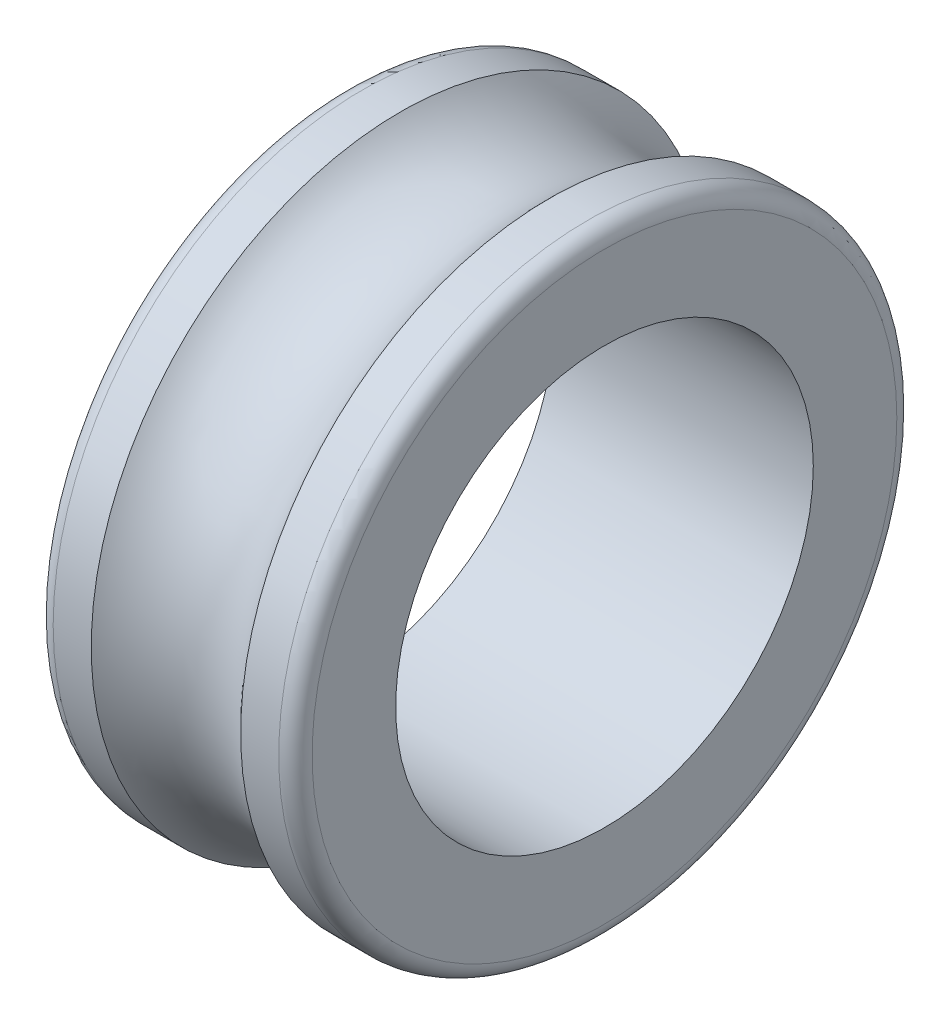
ISO-10303-21;
HEADER;
FILE_DESCRIPTION(('STEP AP214'),'2;1');
FILE_NAME('part.step','',(''),(''),'','','');
FILE_SCHEMA(('AUTOMOTIVE_DESIGN { 1 0 10303 214 1 1 1 1 }'));
ENDSEC;
DATA;
#1=APPLICATION_CONTEXT('core data for automotive mechanical design processes');
#2=APPLICATION_PROTOCOL_DEFINITION('international standard','automotive_design',2000,#1);
#3=PRODUCT_CONTEXT('',#1,'mechanical');
#4=PRODUCT('Part','Part','',(#3));
#5=PRODUCT_RELATED_PRODUCT_CATEGORY('part','',(#4));
#6=PRODUCT_DEFINITION_FORMATION('','',#4);
#7=PRODUCT_DEFINITION_CONTEXT('part definition',#1,'design');
#8=PRODUCT_DEFINITION('design','',#6,#7);
#9=PRODUCT_DEFINITION_SHAPE('','',#8);
#10=(LENGTH_UNIT() NAMED_UNIT(*) SI_UNIT(.MILLI.,.METRE.));
#11=(NAMED_UNIT(*) PLANE_ANGLE_UNIT() SI_UNIT($,.RADIAN.));
#12=(NAMED_UNIT(*) SI_UNIT($,.STERADIAN.) SOLID_ANGLE_UNIT());
#13=UNCERTAINTY_MEASURE_WITH_UNIT(LENGTH_MEASURE(1.E-05),#10,'distance_accuracy_value','');
#14=(GEOMETRIC_REPRESENTATION_CONTEXT(3) GLOBAL_UNCERTAINTY_ASSIGNED_CONTEXT((#13)) GLOBAL_UNIT_ASSIGNED_CONTEXT((#10,
#11,#12)) REPRESENTATION_CONTEXT('',''));
#15=CARTESIAN_POINT('',(0.,0.,0.));
#16=DIRECTION('',(0.,0.,1.));
#17=DIRECTION('',(1.,0.,0.));
#18=AXIS2_PLACEMENT_3D('',#15,#16,#17);
#19=CARTESIAN_POINT('',(15.5,37.,0.));
#20=DIRECTION('',(1.,0.,0.));
#21=DIRECTION('',(0.,0.,-1.));
#22=AXIS2_PLACEMENT_3D('',#19,#20,#21);
#23=PLANE('',#22);
#24=CARTESIAN_POINT('',(15.5,0.,0.));
#25=DIRECTION('',(1.,0.,0.));
#26=DIRECTION('',(0.,0.,-1.));
#27=AXIS2_PLACEMENT_3D('',#24,#25,#26);
#28=CIRCLE('',#27,35.);
#29=CARTESIAN_POINT('',(15.5,0.,-35.));
#30=VERTEX_POINT('',#29);
#31=EDGE_CURVE('E51',#30,#30,#28,.T.);
#32=ORIENTED_EDGE('',*,*,#31,.T.);
#33=EDGE_LOOP('',(#32));
#34=FACE_BOUND('',#33,.T.);
#35=CARTESIAN_POINT('',(15.5,0.,0.));
#36=DIRECTION('',(1.,0.,0.));
#37=DIRECTION('',(0.,0.,-1.));
#38=AXIS2_PLACEMENT_3D('',#35,#36,#37);
#39=CIRCLE('',#38,25.);
#40=CARTESIAN_POINT('',(15.5,0.,-25.));
#41=VERTEX_POINT('',#40);
#42=EDGE_CURVE('E73',#41,#41,#39,.T.);
#43=ORIENTED_EDGE('',*,*,#42,.F.);
#44=EDGE_LOOP('',(#43));
#45=FACE_BOUND('',#44,.T.);
#46=ADVANCED_FACE('F44',(#34,#45),#23,.T.);
#47=CARTESIAN_POINT('',(34.9574468085106,0.,0.));
#48=DIRECTION('',(1.,0.,0.));
#49=DIRECTION('',(0.,0.,-1.));
#50=AXIS2_PLACEMENT_3D('',#47,#48,#49);
#51=CYLINDRICAL_SURFACE('',#50,37.);
#52=CARTESIAN_POINT('',(13.5,0.,0.));
#53=DIRECTION('',(1.,0.,0.));
#54=DIRECTION('',(0.,0.,-1.));
#55=AXIS2_PLACEMENT_3D('',#52,#53,#54);
#56=CIRCLE('',#55,37.);
#57=CARTESIAN_POINT('',(13.5,0.,-37.));
#58=VERTEX_POINT('',#57);
#59=EDGE_CURVE('E12',#58,#58,#56,.F.);
#60=ORIENTED_EDGE('',*,*,#59,.T.);
#61=EDGE_LOOP('',(#60));
#62=FACE_BOUND('',#61,.T.);
#63=CARTESIAN_POINT('',(8.94427190999916,0.,0.));
#64=DIRECTION('',(1.,0.,0.));
#65=DIRECTION('',(0.,0.,-1.));
#66=AXIS2_PLACEMENT_3D('',#63,#64,#65);
#67=CIRCLE('',#66,37.);
#68=CARTESIAN_POINT('',(8.94427190999916,0.,-37.));
#69=VERTEX_POINT('',#68);
#70=EDGE_CURVE('E64',#69,#69,#67,.T.);
#71=ORIENTED_EDGE('',*,*,#70,.T.);
#72=EDGE_LOOP('',(#71));
#73=FACE_BOUND('',#72,.T.);
#74=ADVANCED_FACE('F81',(#62,#73),#51,.T.);
#75=CARTESIAN_POINT('',(0.,0.,0.));
#76=DIRECTION('',(1.,0.,0.));
#77=DIRECTION('',(0.,0.,-1.));
#78=AXIS2_PLACEMENT_3D('',#75,#76,#77);
#79=TOROIDAL_SURFACE('',#78,45.,12.);
#80=CARTESIAN_POINT('',(-8.94427190999916,0.,0.));
#81=DIRECTION('',(1.,0.,0.));
#82=DIRECTION('',(0.,0.,-1.));
#83=AXIS2_PLACEMENT_3D('',#80,#81,#82);
#84=CIRCLE('',#83,37.);
#85=CARTESIAN_POINT('',(-8.94427190999916,0.,-37.));
#86=VERTEX_POINT('',#85);
#87=EDGE_CURVE('E67',#86,#86,#84,.T.);
#88=ORIENTED_EDGE('',*,*,#87,.T.);
#89=EDGE_LOOP('',(#88));
#90=FACE_BOUND('',#89,.T.);
#91=ORIENTED_EDGE('',*,*,#70,.F.);
#92=EDGE_LOOP('',(#91));
#93=FACE_BOUND('',#92,.T.);
#94=ADVANCED_FACE('F86',(#90,#93),#79,.F.);
#95=CARTESIAN_POINT('',(34.9574468085106,0.,0.));
#96=DIRECTION('',(1.,0.,0.));
#97=DIRECTION('',(0.,0.,-1.));
#98=AXIS2_PLACEMENT_3D('',#95,#96,#97);
#99=CYLINDRICAL_SURFACE('',#98,37.);
#100=CARTESIAN_POINT('',(-13.5,0.,0.));
#101=DIRECTION('',(-1.,0.,0.));
#102=DIRECTION('',(0.,0.,1.));
#103=AXIS2_PLACEMENT_3D('',#100,#101,#102);
#104=CIRCLE('',#103,37.);
#105=CARTESIAN_POINT('',(-13.5,0.,37.));
#106=VERTEX_POINT('',#105);
#107=EDGE_CURVE('E59',#106,#106,#104,.F.);
#108=ORIENTED_EDGE('',*,*,#107,.T.);
#109=EDGE_LOOP('',(#108));
#110=FACE_BOUND('',#109,.T.);
#111=ORIENTED_EDGE('',*,*,#87,.F.);
#112=EDGE_LOOP('',(#111));
#113=FACE_BOUND('',#112,.T.);
#114=ADVANCED_FACE('F103',(#110,#113),#99,.T.);
#115=CARTESIAN_POINT('',(-15.5,37.,0.));
#116=DIRECTION('',(-1.,0.,0.));
#117=DIRECTION('',(0.,0.,1.));
#118=AXIS2_PLACEMENT_3D('',#115,#116,#117);
#119=PLANE('',#118);
#120=CARTESIAN_POINT('',(-15.5,0.,0.));
#121=DIRECTION('',(-1.,0.,0.));
#122=DIRECTION('',(0.,0.,1.));
#123=AXIS2_PLACEMENT_3D('',#120,#121,#122);
#124=CIRCLE('',#123,35.);
#125=CARTESIAN_POINT('',(-15.5,0.,35.));
#126=VERTEX_POINT('',#125);
#127=EDGE_CURVE('E55',#126,#126,#124,.T.);
#128=ORIENTED_EDGE('',*,*,#127,.T.);
#129=EDGE_LOOP('',(#128));
#130=FACE_BOUND('',#129,.T.);
#131=CARTESIAN_POINT('',(-15.5,0.,0.));
#132=DIRECTION('',(1.,0.,0.));
#133=DIRECTION('',(0.,0.,-1.));
#134=AXIS2_PLACEMENT_3D('',#131,#132,#133);
#135=CIRCLE('',#134,25.);
#136=CARTESIAN_POINT('',(-15.5,0.,-25.));
#137=VERTEX_POINT('',#136);
#138=EDGE_CURVE('E70',#137,#137,#135,.T.);
#139=ORIENTED_EDGE('',*,*,#138,.T.);
#140=EDGE_LOOP('',(#139));
#141=FACE_BOUND('',#140,.T.);
#142=ADVANCED_FACE('F97',(#130,#141),#119,.T.);
#143=CARTESIAN_POINT('',(34.9574468085106,0.,0.));
#144=DIRECTION('',(1.,0.,0.));
#145=DIRECTION('',(0.,0.,-1.));
#146=AXIS2_PLACEMENT_3D('',#143,#144,#145);
#147=CYLINDRICAL_SURFACE('',#146,25.);
#148=ORIENTED_EDGE('',*,*,#42,.T.);
#149=EDGE_LOOP('',(#148));
#150=FACE_BOUND('',#149,.T.);
#151=ORIENTED_EDGE('',*,*,#138,.F.);
#152=EDGE_LOOP('',(#151));
#153=FACE_BOUND('',#152,.T.);
#154=ADVANCED_FACE('F77',(#150,#153),#147,.F.);
#155=CARTESIAN_POINT('',(-13.5,0.,0.));
#156=DIRECTION('',(-1.,0.,0.));
#157=DIRECTION('',(0.,0.,1.));
#158=AXIS2_PLACEMENT_3D('',#155,#156,#157);
#159=TOROIDAL_SURFACE('',#158,35.,2.);
#160=ORIENTED_EDGE('',*,*,#127,.F.);
#161=EDGE_LOOP('',(#160));
#162=FACE_BOUND('',#161,.T.);
#163=ORIENTED_EDGE('',*,*,#107,.F.);
#164=EDGE_LOOP('',(#163));
#165=FACE_BOUND('',#164,.T.);
#166=ADVANCED_FACE('F89',(#162,#165),#159,.T.);
#167=CARTESIAN_POINT('',(13.5,0.,0.));
#168=DIRECTION('',(1.,0.,0.));
#169=DIRECTION('',(0.,0.,-1.));
#170=AXIS2_PLACEMENT_3D('',#167,#168,#169);
#171=TOROIDAL_SURFACE('',#170,35.,2.);
#172=ORIENTED_EDGE('',*,*,#59,.F.);
#173=EDGE_LOOP('',(#172));
#174=FACE_BOUND('',#173,.T.);
#175=ORIENTED_EDGE('',*,*,#31,.F.);
#176=EDGE_LOOP('',(#175));
#177=FACE_BOUND('',#176,.T.);
#178=ADVANCED_FACE('F46',(#174,#177),#171,.T.);
#179=CLOSED_SHELL('',(#46,#74,#94,#114,#142,#154,#166,#178));
#180=MANIFOLD_SOLID_BREP('B2',#179);
#181=ADVANCED_BREP_SHAPE_REPRESENTATION('',(#18,#180),#14);
#182=SHAPE_DEFINITION_REPRESENTATION(#9,#181);
ENDSEC;
END-ISO-10303-21;
